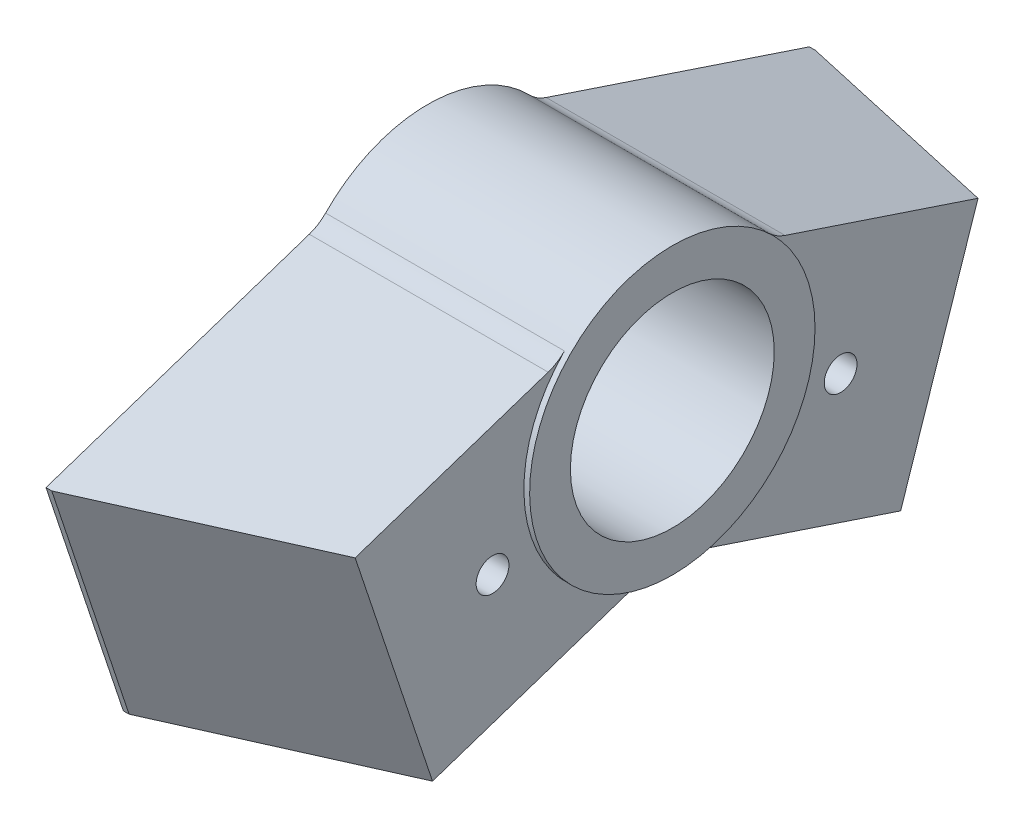
ISO-10303-21;
HEADER;
FILE_DESCRIPTION(('STEP AP214'),'2;1');
FILE_NAME('part.step','',(''),(''),'','','');
FILE_SCHEMA(('AUTOMOTIVE_DESIGN { 1 0 10303 214 1 1 1 1 }'));
ENDSEC;
DATA;
#1=APPLICATION_CONTEXT('core data for automotive mechanical design processes');
#2=APPLICATION_PROTOCOL_DEFINITION('international standard','automotive_design',2000,#1);
#3=PRODUCT_CONTEXT('',#1,'mechanical');
#4=PRODUCT('Part','Part','',(#3));
#5=PRODUCT_RELATED_PRODUCT_CATEGORY('part','',(#4));
#6=PRODUCT_DEFINITION_FORMATION('','',#4);
#7=PRODUCT_DEFINITION_CONTEXT('part definition',#1,'design');
#8=PRODUCT_DEFINITION('design','',#6,#7);
#9=PRODUCT_DEFINITION_SHAPE('','',#8);
#10=(LENGTH_UNIT() NAMED_UNIT(*) SI_UNIT(.MILLI.,.METRE.));
#11=(NAMED_UNIT(*) PLANE_ANGLE_UNIT() SI_UNIT($,.RADIAN.));
#12=(NAMED_UNIT(*) SI_UNIT($,.STERADIAN.) SOLID_ANGLE_UNIT());
#13=UNCERTAINTY_MEASURE_WITH_UNIT(LENGTH_MEASURE(1.E-05),#10,'distance_accuracy_value','');
#14=(GEOMETRIC_REPRESENTATION_CONTEXT(3) GLOBAL_UNCERTAINTY_ASSIGNED_CONTEXT((#13)) GLOBAL_UNIT_ASSIGNED_CONTEXT((#10,
#11,#12)) REPRESENTATION_CONTEXT('',''));
#15=CARTESIAN_POINT('',(0.,0.,0.));
#16=DIRECTION('',(0.,0.,1.));
#17=DIRECTION('',(1.,0.,0.));
#18=AXIS2_PLACEMENT_3D('',#15,#16,#17);
#19=CARTESIAN_POINT('',(101.6,-76.2,-228.6));
#20=DIRECTION('',(-1.,0.,0.));
#21=DIRECTION('',(0.,0.,1.));
#22=AXIS2_PLACEMENT_3D('',#19,#20,#21);
#23=CYLINDRICAL_SURFACE('',#22,22.225);
#24=CARTESIAN_POINT('',(101.6,-76.2,-228.6));
#25=DIRECTION('',(1.,0.,0.));
#26=DIRECTION('',(0.,0.,-1.));
#27=AXIS2_PLACEMENT_3D('',#24,#25,#26);
#28=CIRCLE('',#27,22.225);
#29=CARTESIAN_POINT('',(101.6,-76.2,-250.825));
#30=VERTEX_POINT('',#29);
#31=EDGE_CURVE('E192',#30,#30,#28,.T.);
#32=ORIENTED_EDGE('',*,*,#31,.F.);
#33=EDGE_LOOP('',(#32));
#34=FACE_BOUND('',#33,.T.);
#35=CARTESIAN_POINT('',(100.70528765619,-76.2,-228.6));
#36=DIRECTION('',(1.,0.,0.));
#37=DIRECTION('',(0.,0.,-1.));
#38=AXIS2_PLACEMENT_3D('',#35,#36,#37);
#39=CIRCLE('',#38,22.225);
#40=CARTESIAN_POINT('',(100.70528765619,-60.6779960330943,-244.506540096808));
#41=VERTEX_POINT('',#40);
#42=CARTESIAN_POINT('',(100.70528765619,-98.1615272316095,-232.012029697303));
#43=VERTEX_POINT('',#42);
#44=EDGE_CURVE('E171',#41,#43,#39,.F.);
#45=ORIENTED_EDGE('',*,*,#44,.F.);
#46=DIRECTION('',(-1.,0.,0.));
#47=VECTOR('',#46,1.);
#48=CARTESIAN_POINT('',(101.6,-60.6779960330943,-244.506540096808));
#49=LINE('',#48,#47);
#50=CARTESIAN_POINT('',(63.5,-60.6779960330943,-244.506540096808));
#51=VERTEX_POINT('',#50);
#52=EDGE_CURVE('E209',#41,#51,#49,.T.);
#53=ORIENTED_EDGE('',*,*,#52,.T.);
#54=CARTESIAN_POINT('',(63.5,-76.2,-228.6));
#55=DIRECTION('',(1.,0.,0.));
#56=DIRECTION('',(0.,0.,-1.));
#57=AXIS2_PLACEMENT_3D('',#54,#55,#56);
#58=CIRCLE('',#57,22.225);
#59=CARTESIAN_POINT('',(63.5,-60.6779960331288,-212.693459903158));
#60=VERTEX_POINT('',#59);
#61=EDGE_CURVE('E191',#51,#60,#58,.T.);
#62=ORIENTED_EDGE('',*,*,#61,.T.);
#63=DIRECTION('',(-1.,0.,0.));
#64=VECTOR('',#63,1.);
#65=CARTESIAN_POINT('',(101.6,-60.6779960331288,-212.693459903158));
#66=LINE('',#65,#64);
#67=CARTESIAN_POINT('',(100.70528765619,-60.6779960331288,-212.693459903158));
#68=VERTEX_POINT('',#67);
#69=EDGE_CURVE('E206',#60,#68,#66,.F.);
#70=ORIENTED_EDGE('',*,*,#69,.T.);
#71=CARTESIAN_POINT('',(100.70528765619,-76.2,-228.6));
#72=DIRECTION('',(-1.,0.,0.));
#73=DIRECTION('',(0.,0.,1.));
#74=AXIS2_PLACEMENT_3D('',#71,#72,#73);
#75=CIRCLE('',#74,22.225);
#76=CARTESIAN_POINT('',(100.70528765619,-98.1615272316021,-225.187970302649));
#77=VERTEX_POINT('',#76);
#78=EDGE_CURVE('E189',#68,#77,#75,.F.);
#79=ORIENTED_EDGE('',*,*,#78,.T.);
#80=DIRECTION('',(-1.,0.,0.));
#81=VECTOR('',#80,1.);
#82=CARTESIAN_POINT('',(101.6,-98.1615272316021,-225.187970302649));
#83=LINE('',#82,#81);
#84=CARTESIAN_POINT('',(63.5,-98.1615272316021,-225.187970302649));
#85=VERTEX_POINT('',#84);
#86=EDGE_CURVE('E200',#77,#85,#83,.T.);
#87=ORIENTED_EDGE('',*,*,#86,.T.);
#88=CARTESIAN_POINT('',(63.5,-98.1615272316095,-232.012029697303));
#89=VERTEX_POINT('',#88);
#90=EDGE_CURVE('E196',#85,#89,#58,.T.);
#91=ORIENTED_EDGE('',*,*,#90,.T.);
#92=DIRECTION('',(-1.,0.,0.));
#93=VECTOR('',#92,1.);
#94=CARTESIAN_POINT('',(101.6,-98.1615272316095,-232.012029697303));
#95=LINE('',#94,#93);
#96=EDGE_CURVE('E203',#89,#43,#95,.F.);
#97=ORIENTED_EDGE('',*,*,#96,.T.);
#98=EDGE_LOOP('',(#45,#53,#62,#70,#79,#87,#91,#97));
#99=FACE_BOUND('',#98,.T.);
#100=ADVANCED_FACE('F32',(#34,#99),#23,.T.);
#101=CARTESIAN_POINT('',(101.6,-76.2,-228.6));
#102=DIRECTION('',(1.,0.,0.));
#103=DIRECTION('',(0.,0.,-1.));
#104=AXIS2_PLACEMENT_3D('',#101,#102,#103);
#105=PLANE('',#104);
#106=CARTESIAN_POINT('',(101.6,-76.2,-228.6));
#107=DIRECTION('',(1.,0.,0.));
#108=DIRECTION('',(0.,0.,-1.));
#109=AXIS2_PLACEMENT_3D('',#106,#107,#108);
#110=CIRCLE('',#109,15.875);
#111=CARTESIAN_POINT('',(101.6,-76.2,-244.475));
#112=VERTEX_POINT('',#111);
#113=EDGE_CURVE('E165',#112,#112,#110,.T.);
#114=ORIENTED_EDGE('',*,*,#113,.F.);
#115=EDGE_LOOP('',(#114));
#116=FACE_BOUND('',#115,.T.);
#117=ORIENTED_EDGE('',*,*,#31,.T.);
#118=EDGE_LOOP('',(#117));
#119=FACE_BOUND('',#118,.T.);
#120=ADVANCED_FACE('F308',(#116,#119),#105,.T.);
#121=CARTESIAN_POINT('',(63.5,-76.2,-228.6));
#122=DIRECTION('',(1.,0.,0.));
#123=DIRECTION('',(0.,0.,-1.));
#124=AXIS2_PLACEMENT_3D('',#121,#122,#123);
#125=PLANE('',#124);
#126=CARTESIAN_POINT('',(63.5,-85.2362084139313,-201.491374758207));
#127=DIRECTION('',(1.,0.,0.));
#128=DIRECTION('',(0.,0.,-1.));
#129=AXIS2_PLACEMENT_3D('',#126,#127,#128);
#130=CIRCLE('',#129,2.55269999999999);
#131=CARTESIAN_POINT('',(63.5,-85.2362084139313,-204.044074758207));
#132=VERTEX_POINT('',#131);
#133=EDGE_CURVE('E291',#132,#132,#130,.T.);
#134=ORIENTED_EDGE('',*,*,#133,.T.);
#135=EDGE_LOOP('',(#134));
#136=FACE_BOUND('',#135,.T.);
#137=CARTESIAN_POINT('',(63.4999999999999,-85.2362084139314,-255.708625241793));
#138=DIRECTION('',(1.,0.,0.));
#139=DIRECTION('',(0.,0.,-1.));
#140=AXIS2_PLACEMENT_3D('',#137,#138,#139);
#141=CIRCLE('',#140,2.55269999999999);
#142=CARTESIAN_POINT('',(63.4999999999999,-85.2362084139314,-258.261325241793));
#143=VERTEX_POINT('',#142);
#144=EDGE_CURVE('E283',#143,#143,#141,.T.);
#145=ORIENTED_EDGE('',*,*,#144,.T.);
#146=EDGE_LOOP('',(#145));
#147=FACE_BOUND('',#146,.T.);
#148=CARTESIAN_POINT('',(63.5,-76.2,-228.6));
#149=DIRECTION('',(1.,0.,0.));
#150=DIRECTION('',(0.,0.,-1.));
#151=AXIS2_PLACEMENT_3D('',#148,#149,#150);
#152=CIRCLE('',#151,15.875);
#153=CARTESIAN_POINT('',(63.5,-76.2,-244.475));
#154=VERTEX_POINT('',#153);
#155=EDGE_CURVE('E169',#154,#154,#152,.T.);
#156=ORIENTED_EDGE('',*,*,#155,.T.);
#157=EDGE_LOOP('',(#156));
#158=FACE_BOUND('',#157,.T.);
#159=ORIENTED_EDGE('',*,*,#90,.F.);
#160=CARTESIAN_POINT('',(63.5,-104.436249297774,-224.213104674835));
#161=DIRECTION('',(1.,0.,0.));
#162=DIRECTION('',(0.,0.,-1.));
#163=AXIS2_PLACEMENT_3D('',#160,#161,#162);
#164=CIRCLE('',#163,6.35);
#165=CARTESIAN_POINT('',(63.5,-98.4121103552231,-222.205058360651));
#166=VERTEX_POINT('',#165);
#167=EDGE_CURVE('E40',#85,#166,#164,.T.);
#168=ORIENTED_EDGE('',*,*,#167,.T.);
#169=DIRECTION('',(0.,0.316227766016061,-0.948683298050773));
#170=VECTOR('',#169,1.);
#171=CARTESIAN_POINT('',(63.5,-97.8924738025993,-223.763968018527));
#172=LINE('',#171,#170);
#173=CARTESIAN_POINT('',(63.5,-112.08120913018,-181.197762035668));
#174=VERTEX_POINT('',#173);
#175=EDGE_CURVE('E276',#174,#166,#172,.T.);
#176=ORIENTED_EDGE('',*,*,#175,.F.);
#177=DIRECTION('',(0.,-0.948683298050514,-0.316227766016838));
#178=VECTOR('',#177,1.);
#179=CARTESIAN_POINT('',(63.5,-112.08120913018,-181.197762035668));
#180=LINE('',#179,#178);
#181=CARTESIAN_POINT('',(63.5,-75.9363754744556,-169.149484150427));
#182=VERTEX_POINT('',#181);
#183=EDGE_CURVE('E264',#182,#174,#180,.T.);
#184=ORIENTED_EDGE('',*,*,#183,.F.);
#185=DIRECTION('',(0.,-0.316227766016117,0.948683298050754));
#186=VECTOR('',#185,1.);
#187=CARTESIAN_POINT('',(63.5,-75.9363754744557,-169.149484150426));
#188=LINE('',#187,#186);
#189=CARTESIAN_POINT('',(63.5,-62.2672766994962,-210.156780475409));
#190=VERTEX_POINT('',#189);
#191=EDGE_CURVE('E265',#190,#182,#188,.T.);
#192=ORIENTED_EDGE('',*,*,#191,.F.);
#193=CARTESIAN_POINT('',(63.5,-56.24313775688,-208.148734161203));
#194=DIRECTION('',(1.,0.,0.));
#195=DIRECTION('',(0.,0.,-1.));
#196=AXIS2_PLACEMENT_3D('',#193,#194,#195);
#197=CIRCLE('',#196,6.35);
#198=EDGE_CURVE('E224',#190,#60,#197,.T.);
#199=ORIENTED_EDGE('',*,*,#198,.T.);
#200=ORIENTED_EDGE('',*,*,#61,.F.);
#201=CARTESIAN_POINT('',(63.5,-56.2431377568356,-249.051265838753));
#202=DIRECTION('',(1.,0.,0.));
#203=DIRECTION('',(0.,0.,-1.));
#204=AXIS2_PLACEMENT_3D('',#201,#202,#203);
#205=CIRCLE('',#204,6.35);
#206=CARTESIAN_POINT('',(63.5,-62.2672766994538,-247.043219524547));
#207=VERTEX_POINT('',#206);
#208=EDGE_CURVE('E220',#51,#207,#205,.T.);
#209=ORIENTED_EDGE('',*,*,#208,.T.);
#210=DIRECTION('',(0.,0.316227766016693,0.948683298050562));
#211=VECTOR('',#210,1.);
#212=CARTESIAN_POINT('',(63.5,-61.747640146838,-245.484309866699));
#213=LINE('',#212,#211);
#214=CARTESIAN_POINT('',(63.5,-75.9363754744556,-288.050515849574));
#215=VERTEX_POINT('',#214);
#216=EDGE_CURVE('E269',#215,#207,#213,.T.);
#217=ORIENTED_EDGE('',*,*,#216,.F.);
#218=DIRECTION('',(0.,0.948683298050514,-0.316227766016838));
#219=VECTOR('',#218,1.);
#220=CARTESIAN_POINT('',(63.5,-75.9363754744557,-288.050515849574));
#221=LINE('',#220,#219);
#222=CARTESIAN_POINT('',(63.5,-112.08120913018,-276.002237964332));
#223=VERTEX_POINT('',#222);
#224=EDGE_CURVE('E139',#223,#215,#221,.T.);
#225=ORIENTED_EDGE('',*,*,#224,.F.);
#226=DIRECTION('',(0.,-0.316227766017148,-0.94868329805041));
#227=VECTOR('',#226,1.);
#228=CARTESIAN_POINT('',(63.5,-112.08120913018,-276.002237964332));
#229=LINE('',#228,#227);
#230=CARTESIAN_POINT('',(63.5,-98.4121103551587,-234.994941639312));
#231=VERTEX_POINT('',#230);
#232=EDGE_CURVE('E143',#231,#223,#229,.T.);
#233=ORIENTED_EDGE('',*,*,#232,.F.);
#234=CARTESIAN_POINT('',(63.5,-104.436249297784,-232.986895325104));
#235=DIRECTION('',(1.,0.,0.));
#236=DIRECTION('',(0.,0.,-1.));
#237=AXIS2_PLACEMENT_3D('',#234,#235,#236);
#238=CIRCLE('',#237,6.35);
#239=EDGE_CURVE('E226',#231,#89,#238,.T.);
#240=ORIENTED_EDGE('',*,*,#239,.T.);
#241=EDGE_LOOP('',(#159,#168,#176,#184,#192,#199,#200,#209,#217,#225,#233,#240));
#242=FACE_BOUND('',#241,.T.);
#243=ADVANCED_FACE('F241',(#136,#147,#158,#242),#125,.F.);
#244=CARTESIAN_POINT('',(100.705287655612,166534.347129812,-500000.));
#245=DIRECTION('',(-1.,0.,0.));
#246=DIRECTION('',(0.,0.,1.));
#247=AXIS2_PLACEMENT_3D('',#244,#245,#246);
#248=PLANE('',#247);
#249=CARTESIAN_POINT('',(100.70528765619,-85.2362084139313,-201.491374758207));
#250=DIRECTION('',(1.,0.,0.));
#251=DIRECTION('',(0.,0.,-1.));
#252=AXIS2_PLACEMENT_3D('',#249,#250,#251);
#253=CIRCLE('',#252,2.55269999999999);
#254=CARTESIAN_POINT('',(100.70528765619,-85.2362084139313,-204.044074758207));
#255=VERTEX_POINT('',#254);
#256=EDGE_CURVE('E294',#255,#255,#253,.T.);
#257=ORIENTED_EDGE('',*,*,#256,.F.);
#258=EDGE_LOOP('',(#257));
#259=FACE_BOUND('',#258,.T.);
#260=ORIENTED_EDGE('',*,*,#78,.F.);
#261=CARTESIAN_POINT('',(100.70528765619,-56.24313775688,-208.148734161203));
#262=DIRECTION('',(-1.,0.,0.));
#263=DIRECTION('',(0.,0.,1.));
#264=AXIS2_PLACEMENT_3D('',#261,#262,#263);
#265=CIRCLE('',#264,6.35);
#266=CARTESIAN_POINT('',(100.70528765619,-62.2672766995152,-210.156780475245));
#267=VERTEX_POINT('',#266);
#268=EDGE_CURVE('E222',#68,#267,#265,.T.);
#269=ORIENTED_EDGE('',*,*,#268,.T.);
#270=DIRECTION('',(0.,-0.316227766016844,0.948683298050512));
#271=VECTOR('',#270,1.);
#272=CARTESIAN_POINT('',(100.705287655612,166534.347129812,-500000.));
#273=LINE('',#272,#271);
#274=CARTESIAN_POINT('',(100.70528765619,-72.2873739605623,-180.096488692107));
#275=VERTEX_POINT('',#274);
#276=EDGE_CURVE('E178',#267,#275,#273,.T.);
#277=ORIENTED_EDGE('',*,*,#276,.T.);
#278=DIRECTION('',(0.,-0.948683298050514,-0.316227766016838));
#279=VECTOR('',#278,1.);
#280=CARTESIAN_POINT('',(100.70528765619,-72.2873739605623,-180.096488692107));
#281=LINE('',#280,#279);
#282=CARTESIAN_POINT('',(100.70528765619,-108.432207616287,-192.144766577348));
#283=VERTEX_POINT('',#282);
#284=EDGE_CURVE('E174',#275,#283,#281,.T.);
#285=ORIENTED_EDGE('',*,*,#284,.T.);
#286=DIRECTION('',(0.,-0.316227766016844,0.948683298050512));
#287=VECTOR('',#286,1.);
#288=CARTESIAN_POINT('',(100.705287655612,166498.202296156,-500012.048277885));
#289=LINE('',#288,#287);
#290=CARTESIAN_POINT('',(100.70528765619,-98.4121103552411,-222.205058360487));
#291=VERTEX_POINT('',#290);
#292=EDGE_CURVE('E187',#291,#283,#289,.T.);
#293=ORIENTED_EDGE('',*,*,#292,.F.);
#294=CARTESIAN_POINT('',(100.70528765619,-104.436249297774,-224.213104674835));
#295=DIRECTION('',(-1.,0.,0.));
#296=DIRECTION('',(0.,0.,1.));
#297=AXIS2_PLACEMENT_3D('',#294,#295,#296);
#298=CIRCLE('',#297,6.35);
#299=EDGE_CURVE('E11',#291,#77,#298,.T.);
#300=ORIENTED_EDGE('',*,*,#299,.T.);
#301=EDGE_LOOP('',(#260,#269,#277,#285,#293,#300));
#302=FACE_BOUND('',#301,.T.);
#303=ADVANCED_FACE('F247',(#259,#302),#248,.F.);
#304=CARTESIAN_POINT('',(64.3947123432313,166494.553294643,-500001.101273344));
#305=DIRECTION('',(0.,0.948683298050512,0.316227766016844));
#306=DIRECTION('',(0.,-0.316227766016844,0.948683298050512));
#307=AXIS2_PLACEMENT_3D('',#304,#305,#306);
#308=PLANE('',#307);
#309=ORIENTED_EDGE('',*,*,#175,.T.);
#310=DIRECTION('',(1.,0.,0.));
#311=VECTOR('',#310,1.);
#312=CARTESIAN_POINT('',(100.70528765619,-98.4121103551556,-222.205058360629));
#313=LINE('',#312,#311);
#314=EDGE_CURVE('E53',#166,#291,#313,.T.);
#315=ORIENTED_EDGE('',*,*,#314,.T.);
#316=ORIENTED_EDGE('',*,*,#292,.T.);
#317=DIRECTION('',(-0.953033472765887,-0.0957743179499562,0.28732295384987));
#318=VECTOR('',#317,1.);
#319=CARTESIAN_POINT('',(64.3947123438099,-112.08120913018,-181.197762035668));
#320=LINE('',#319,#318);
#321=CARTESIAN_POINT('',(64.3947123438099,-112.08120913018,-181.197762035668));
#322=VERTEX_POINT('',#321);
#323=EDGE_CURVE('E182',#283,#322,#320,.T.);
#324=ORIENTED_EDGE('',*,*,#323,.T.);
#325=DIRECTION('',(1.,0.,0.));
#326=VECTOR('',#325,1.);
#327=CARTESIAN_POINT('',(-10.7711923613458,-112.08120913018,-181.197762035668));
#328=LINE('',#327,#326);
#329=EDGE_CURVE('E261',#174,#322,#328,.T.);
#330=ORIENTED_EDGE('',*,*,#329,.F.);
#331=EDGE_LOOP('',(#309,#315,#316,#324,#330));
#332=FACE_BOUND('',#331,.T.);
#333=ADVANCED_FACE('F251',(#332),#308,.F.);
#334=CARTESIAN_POINT('',(64.3947123432313,166530.698128298,-499989.052995458));
#335=DIRECTION('',(0.,-0.948683298050512,-0.316227766016844));
#336=DIRECTION('',(0.,0.316227766016844,-0.948683298050512));
#337=AXIS2_PLACEMENT_3D('',#334,#335,#336);
#338=PLANE('',#337);
#339=ORIENTED_EDGE('',*,*,#276,.F.);
#340=DIRECTION('',(1.,0.,0.));
#341=VECTOR('',#340,1.);
#342=CARTESIAN_POINT('',(63.5,-62.2672766994985,-210.15678047541));
#343=LINE('',#342,#341);
#344=EDGE_CURVE('E211',#267,#190,#343,.F.);
#345=ORIENTED_EDGE('',*,*,#344,.T.);
#346=ORIENTED_EDGE('',*,*,#191,.T.);
#347=DIRECTION('',(1.,0.,0.));
#348=VECTOR('',#347,1.);
#349=CARTESIAN_POINT('',(-10.7711923613458,-75.9363754744557,-169.149484150426));
#350=LINE('',#349,#348);
#351=CARTESIAN_POINT('',(64.3947123438099,-75.9363754744556,-169.149484150427));
#352=VERTEX_POINT('',#351);
#353=EDGE_CURVE('E266',#182,#352,#350,.T.);
#354=ORIENTED_EDGE('',*,*,#353,.T.);
#355=DIRECTION('',(0.953033472765887,0.0957743179499562,-0.28732295384987));
#356=VECTOR('',#355,1.);
#357=CARTESIAN_POINT('',(64.3947123438099,-75.9363754744556,-169.149484150427));
#358=LINE('',#357,#356);
#359=EDGE_CURVE('E175',#352,#275,#358,.T.);
#360=ORIENTED_EDGE('',*,*,#359,.T.);
#361=EDGE_LOOP('',(#339,#345,#346,#354,#360));
#362=FACE_BOUND('',#361,.T.);
#363=ADVANCED_FACE('F306',(#362),#338,.F.);
#364=CARTESIAN_POINT('',(-33.4800061517165,33.3153680589672,-99.9461041769018));
#365=DIRECTION('',(0.302864986071011,-0.301375646032025,0.904126938096076));
#366=DIRECTION('',(0.948213667692879,0.,-0.31763318529464));
#367=AXIS2_PLACEMENT_3D('',#364,#365,#366);
#368=PLANE('',#367);
#369=ORIENTED_EDGE('',*,*,#284,.F.);
#370=ORIENTED_EDGE('',*,*,#359,.F.);
#371=DIRECTION('',(0.,0.948683298050514,0.316227766016838));
#372=VECTOR('',#371,1.);
#373=CARTESIAN_POINT('',(64.3947123438099,-75.9363754744556,-169.149484150427));
#374=LINE('',#373,#372);
#375=EDGE_CURVE('E179',#322,#352,#374,.T.);
#376=ORIENTED_EDGE('',*,*,#375,.F.);
#377=ORIENTED_EDGE('',*,*,#323,.F.);
#378=EDGE_LOOP('',(#369,#370,#376,#377));
#379=FACE_BOUND('',#378,.T.);
#380=ADVANCED_FACE('F255',(#379),#368,.T.);
#381=CARTESIAN_POINT('',(64.3947123432308,166683.098128298,499989.052995458));
#382=DIRECTION('',(0.,0.948683298050512,-0.316227766016844));
#383=DIRECTION('',(0.,0.316227766016844,0.948683298050512));
#384=AXIS2_PLACEMENT_3D('',#381,#382,#383);
#385=PLANE('',#384);
#386=ORIENTED_EDGE('',*,*,#216,.T.);
#387=DIRECTION('',(-1.,0.,0.));
#388=VECTOR('',#387,1.);
#389=CARTESIAN_POINT('',(64.3947123432308,-62.2672766994299,-247.043219524471));
#390=LINE('',#389,#388);
#391=CARTESIAN_POINT('',(100.70528765619,-62.2672766994583,-247.043219524528));
#392=VERTEX_POINT('',#391);
#393=EDGE_CURVE('E195',#207,#392,#390,.F.);
#394=ORIENTED_EDGE('',*,*,#393,.T.);
#395=DIRECTION('',(0.,-0.316227766016844,-0.948683298050512));
#396=VECTOR('',#395,1.);
#397=CARTESIAN_POINT('',(100.705287655611,166686.747129812,500000.));
#398=LINE('',#397,#396);
#399=CARTESIAN_POINT('',(100.70528765619,-72.2873739605623,-277.103511307893));
#400=VERTEX_POINT('',#399);
#401=EDGE_CURVE('E158',#392,#400,#398,.T.);
#402=ORIENTED_EDGE('',*,*,#401,.T.);
#403=DIRECTION('',(0.953033472765887,0.0957743179499562,0.28732295384987));
#404=VECTOR('',#403,1.);
#405=CARTESIAN_POINT('',(64.3947123438099,-75.9363754744556,-288.050515849574));
#406=LINE('',#405,#404);
#407=CARTESIAN_POINT('',(64.3947123438098,-75.9363754744556,-288.050515849574));
#408=VERTEX_POINT('',#407);
#409=EDGE_CURVE('E151',#408,#400,#406,.T.);
#410=ORIENTED_EDGE('',*,*,#409,.F.);
#411=DIRECTION('',(1.,0.,0.));
#412=VECTOR('',#411,1.);
#413=CARTESIAN_POINT('',(-10.771192361346,-75.9363754744557,-288.050515849573));
#414=LINE('',#413,#412);
#415=EDGE_CURVE('E132',#215,#408,#414,.T.);
#416=ORIENTED_EDGE('',*,*,#415,.F.);
#417=EDGE_LOOP('',(#386,#394,#402,#410,#416));
#418=FACE_BOUND('',#417,.T.);
#419=ADVANCED_FACE('F155',(#418),#385,.T.);
#420=CARTESIAN_POINT('',(-33.4800061517165,33.3153680589672,-357.253895823098));
#421=DIRECTION('',(0.302864986071011,-0.301375646032025,-0.904126938096076));
#422=DIRECTION('',(0.948213667692879,0.,0.31763318529464));
#423=AXIS2_PLACEMENT_3D('',#420,#421,#422);
#424=PLANE('',#423);
#425=DIRECTION('',(0.,-0.948683298050514,0.316227766016838));
#426=VECTOR('',#425,1.);
#427=CARTESIAN_POINT('',(100.70528765619,-72.2873739605623,-277.103511307893));
#428=LINE('',#427,#426);
#429=CARTESIAN_POINT('',(100.70528765619,-108.432207616287,-265.055233422652));
#430=VERTEX_POINT('',#429);
#431=EDGE_CURVE('E167',#400,#430,#428,.T.);
#432=ORIENTED_EDGE('',*,*,#431,.T.);
#433=DIRECTION('',(-0.953033472765887,-0.0957743179499562,-0.28732295384987));
#434=VECTOR('',#433,1.);
#435=CARTESIAN_POINT('',(64.3947123438099,-112.08120913018,-276.002237964332));
#436=LINE('',#435,#434);
#437=CARTESIAN_POINT('',(64.3947123438099,-112.08120913018,-276.002237964332));
#438=VERTEX_POINT('',#437);
#439=EDGE_CURVE('E153',#430,#438,#436,.T.);
#440=ORIENTED_EDGE('',*,*,#439,.T.);
#441=DIRECTION('',(0.,0.948683298050514,-0.316227766016838));
#442=VECTOR('',#441,1.);
#443=CARTESIAN_POINT('',(64.3947123438099,-75.9363754744556,-288.050515849574));
#444=LINE('',#443,#442);
#445=EDGE_CURVE('E136',#438,#408,#444,.T.);
#446=ORIENTED_EDGE('',*,*,#445,.T.);
#447=ORIENTED_EDGE('',*,*,#409,.T.);
#448=EDGE_LOOP('',(#432,#440,#446,#447));
#449=FACE_BOUND('',#448,.T.);
#450=ADVANCED_FACE('F150',(#449),#424,.T.);
#451=CARTESIAN_POINT('',(100.705287655611,166686.747129812,500000.));
#452=DIRECTION('',(1.,0.,0.));
#453=DIRECTION('',(0.,0.,-1.));
#454=AXIS2_PLACEMENT_3D('',#451,#452,#453);
#455=PLANE('',#454);
#456=CARTESIAN_POINT('',(100.70528765619,-85.2362084139314,-255.708625241793));
#457=DIRECTION('',(1.,0.,0.));
#458=DIRECTION('',(0.,0.,-1.));
#459=AXIS2_PLACEMENT_3D('',#456,#457,#458);
#460=CIRCLE('',#459,2.55269999999999);
#461=CARTESIAN_POINT('',(100.70528765619,-85.2362084139314,-258.261325241793));
#462=VERTEX_POINT('',#461);
#463=EDGE_CURVE('E288',#462,#462,#460,.T.);
#464=ORIENTED_EDGE('',*,*,#463,.F.);
#465=EDGE_LOOP('',(#464));
#466=FACE_BOUND('',#465,.T.);
#467=ORIENTED_EDGE('',*,*,#401,.F.);
#468=CARTESIAN_POINT('',(100.70528765619,-56.2431377568356,-249.051265838753));
#469=DIRECTION('',(1.,0.,0.));
#470=DIRECTION('',(0.,0.,-1.));
#471=AXIS2_PLACEMENT_3D('',#468,#469,#470);
#472=CIRCLE('',#471,6.35);
#473=EDGE_CURVE('E217',#392,#41,#472,.F.);
#474=ORIENTED_EDGE('',*,*,#473,.T.);
#475=ORIENTED_EDGE('',*,*,#44,.T.);
#476=CARTESIAN_POINT('',(100.70528765619,-104.436249297784,-232.986895325104));
#477=DIRECTION('',(1.,0.,0.));
#478=DIRECTION('',(0.,0.,-1.));
#479=AXIS2_PLACEMENT_3D('',#476,#477,#478);
#480=CIRCLE('',#479,6.35);
#481=CARTESIAN_POINT('',(100.70528765619,-98.4121103552127,-234.9949416394));
#482=VERTEX_POINT('',#481);
#483=EDGE_CURVE('E228',#43,#482,#480,.F.);
#484=ORIENTED_EDGE('',*,*,#483,.T.);
#485=DIRECTION('',(0.,-0.316227766016844,-0.948683298050512));
#486=VECTOR('',#485,1.);
#487=CARTESIAN_POINT('',(100.705287655611,166650.602296156,500012.048277885));
#488=LINE('',#487,#486);
#489=EDGE_CURVE('E160',#482,#430,#488,.T.);
#490=ORIENTED_EDGE('',*,*,#489,.T.);
#491=ORIENTED_EDGE('',*,*,#431,.F.);
#492=EDGE_LOOP('',(#467,#474,#475,#484,#490,#491));
#493=FACE_BOUND('',#492,.T.);
#494=ADVANCED_FACE('F232',(#466,#493),#455,.T.);
#495=CARTESIAN_POINT('',(64.3947123432308,166646.953294643,500001.101273344));
#496=DIRECTION('',(0.,-0.948683298050512,0.316227766016844));
#497=DIRECTION('',(0.,-0.316227766016844,-0.948683298050512));
#498=AXIS2_PLACEMENT_3D('',#495,#496,#497);
#499=PLANE('',#498);
#500=ORIENTED_EDGE('',*,*,#489,.F.);
#501=DIRECTION('',(-1.,0.,0.));
#502=VECTOR('',#501,1.);
#503=CARTESIAN_POINT('',(64.3947123432308,-98.4121103551274,-234.994941639229));
#504=LINE('',#503,#502);
#505=EDGE_CURVE('E213',#482,#231,#504,.T.);
#506=ORIENTED_EDGE('',*,*,#505,.T.);
#507=ORIENTED_EDGE('',*,*,#232,.T.);
#508=DIRECTION('',(1.,0.,0.));
#509=VECTOR('',#508,1.);
#510=CARTESIAN_POINT('',(-10.7711923613459,-112.08120913018,-276.002237964332));
#511=LINE('',#510,#509);
#512=EDGE_CURVE('E144',#223,#438,#511,.T.);
#513=ORIENTED_EDGE('',*,*,#512,.T.);
#514=ORIENTED_EDGE('',*,*,#439,.F.);
#515=EDGE_LOOP('',(#500,#506,#507,#513,#514));
#516=FACE_BOUND('',#515,.T.);
#517=ADVANCED_FACE('F237',(#516),#499,.T.);
#518=CARTESIAN_POINT('',(63.5,-76.2,-228.6));
#519=DIRECTION('',(1.,0.,0.));
#520=DIRECTION('',(0.,0.,-1.));
#521=AXIS2_PLACEMENT_3D('',#518,#519,#520);
#522=CYLINDRICAL_SURFACE('',#521,15.875);
#523=ORIENTED_EDGE('',*,*,#155,.F.);
#524=EDGE_LOOP('',(#523));
#525=FACE_BOUND('',#524,.T.);
#526=ORIENTED_EDGE('',*,*,#113,.T.);
#527=EDGE_LOOP('',(#526));
#528=FACE_BOUND('',#527,.T.);
#529=ADVANCED_FACE('F313',(#525,#528),#522,.F.);
#530=CARTESIAN_POINT('',(-10.7711923613458,-112.08120913018,-181.197762035668));
#531=DIRECTION('',(0.,0.316227766016838,-0.948683298050514));
#532=DIRECTION('',(0.,0.948683298050514,0.316227766016838));
#533=AXIS2_PLACEMENT_3D('',#530,#531,#532);
#534=PLANE('',#533);
#535=ORIENTED_EDGE('',*,*,#353,.F.);
#536=ORIENTED_EDGE('',*,*,#183,.T.);
#537=ORIENTED_EDGE('',*,*,#329,.T.);
#538=ORIENTED_EDGE('',*,*,#375,.T.);
#539=EDGE_LOOP('',(#535,#536,#537,#538));
#540=FACE_BOUND('',#539,.T.);
#541=ADVANCED_FACE('F262',(#540),#534,.F.);
#542=CARTESIAN_POINT('',(-10.771192361346,-75.9363754744557,-288.050515849573));
#543=DIRECTION('',(0.,0.316227766016838,0.948683298050514));
#544=DIRECTION('',(0.,-0.948683298050514,0.316227766016838));
#545=AXIS2_PLACEMENT_3D('',#542,#543,#544);
#546=PLANE('',#545);
#547=ORIENTED_EDGE('',*,*,#512,.F.);
#548=ORIENTED_EDGE('',*,*,#224,.T.);
#549=ORIENTED_EDGE('',*,*,#415,.T.);
#550=ORIENTED_EDGE('',*,*,#445,.F.);
#551=EDGE_LOOP('',(#547,#548,#549,#550));
#552=FACE_BOUND('',#551,.T.);
#553=ADVANCED_FACE('F135',(#552),#546,.F.);
#554=CARTESIAN_POINT('',(101.6,-56.2431377568356,-249.051265838753));
#555=DIRECTION('',(-1.,0.,0.));
#556=DIRECTION('',(0.,0.,1.));
#557=AXIS2_PLACEMENT_3D('',#554,#555,#556);
#558=CYLINDRICAL_SURFACE('',#557,6.35);
#559=ORIENTED_EDGE('',*,*,#208,.F.);
#560=ORIENTED_EDGE('',*,*,#52,.F.);
#561=ORIENTED_EDGE('',*,*,#473,.F.);
#562=ORIENTED_EDGE('',*,*,#393,.F.);
#563=EDGE_LOOP('',(#559,#560,#561,#562));
#564=FACE_BOUND('',#563,.T.);
#565=ADVANCED_FACE('F324',(#564),#558,.F.);
#566=CARTESIAN_POINT('',(101.6,-56.24313775688,-208.148734161203));
#567=DIRECTION('',(-1.,0.,0.));
#568=DIRECTION('',(0.,0.,1.));
#569=AXIS2_PLACEMENT_3D('',#566,#567,#568);
#570=CYLINDRICAL_SURFACE('',#569,6.35);
#571=ORIENTED_EDGE('',*,*,#198,.F.);
#572=ORIENTED_EDGE('',*,*,#344,.F.);
#573=ORIENTED_EDGE('',*,*,#268,.F.);
#574=ORIENTED_EDGE('',*,*,#69,.F.);
#575=EDGE_LOOP('',(#571,#572,#573,#574));
#576=FACE_BOUND('',#575,.T.);
#577=ADVANCED_FACE('F327',(#576),#570,.F.);
#578=CARTESIAN_POINT('',(101.6,-104.436249297784,-232.986895325104));
#579=DIRECTION('',(-1.,0.,0.));
#580=DIRECTION('',(0.,0.,1.));
#581=AXIS2_PLACEMENT_3D('',#578,#579,#580);
#582=CYLINDRICAL_SURFACE('',#581,6.35);
#583=ORIENTED_EDGE('',*,*,#483,.F.);
#584=ORIENTED_EDGE('',*,*,#96,.F.);
#585=ORIENTED_EDGE('',*,*,#239,.F.);
#586=ORIENTED_EDGE('',*,*,#505,.F.);
#587=EDGE_LOOP('',(#583,#584,#585,#586));
#588=FACE_BOUND('',#587,.T.);
#589=ADVANCED_FACE('F239',(#588),#582,.F.);
#590=CARTESIAN_POINT('',(101.6,-104.436249297774,-224.213104674835));
#591=DIRECTION('',(-1.,0.,0.));
#592=DIRECTION('',(0.,0.,1.));
#593=AXIS2_PLACEMENT_3D('',#590,#591,#592);
#594=CYLINDRICAL_SURFACE('',#593,6.35);
#595=ORIENTED_EDGE('',*,*,#299,.F.);
#596=ORIENTED_EDGE('',*,*,#314,.F.);
#597=ORIENTED_EDGE('',*,*,#167,.F.);
#598=ORIENTED_EDGE('',*,*,#86,.F.);
#599=EDGE_LOOP('',(#595,#596,#597,#598));
#600=FACE_BOUND('',#599,.T.);
#601=ADVANCED_FACE('F34',(#600),#594,.F.);
#602=CARTESIAN_POINT('',(100.70528765619,-85.2362084139314,-255.708625241793));
#603=DIRECTION('',(1.,0.,0.));
#604=DIRECTION('',(0.,0.,-1.));
#605=AXIS2_PLACEMENT_3D('',#602,#603,#604);
#606=CYLINDRICAL_SURFACE('',#605,2.55269999999999);
#607=ORIENTED_EDGE('',*,*,#144,.F.);
#608=EDGE_LOOP('',(#607));
#609=FACE_BOUND('',#608,.T.);
#610=ORIENTED_EDGE('',*,*,#463,.T.);
#611=EDGE_LOOP('',(#610));
#612=FACE_BOUND('',#611,.T.);
#613=ADVANCED_FACE('F335',(#609,#612),#606,.F.);
#614=CARTESIAN_POINT('',(100.70528765619,-85.2362084139313,-201.491374758207));
#615=DIRECTION('',(1.,0.,0.));
#616=DIRECTION('',(0.,0.,-1.));
#617=AXIS2_PLACEMENT_3D('',#614,#615,#616);
#618=CYLINDRICAL_SURFACE('',#617,2.55269999999999);
#619=ORIENTED_EDGE('',*,*,#133,.F.);
#620=EDGE_LOOP('',(#619));
#621=FACE_BOUND('',#620,.T.);
#622=ORIENTED_EDGE('',*,*,#256,.T.);
#623=EDGE_LOOP('',(#622));
#624=FACE_BOUND('',#623,.T.);
#625=ADVANCED_FACE('F298',(#621,#624),#618,.F.);
#626=CLOSED_SHELL('',(#100,#120,#243,#303,#333,#363,#380,#419,#450,#494,#517,#529,#541,#553,
#565,#577,#589,#601,#613,#625));
#627=MANIFOLD_SOLID_BREP('B2',#626);
#628=ADVANCED_BREP_SHAPE_REPRESENTATION('',(#18,#627),#14);
#629=SHAPE_DEFINITION_REPRESENTATION(#9,#628);
ENDSEC;
END-ISO-10303-21;
